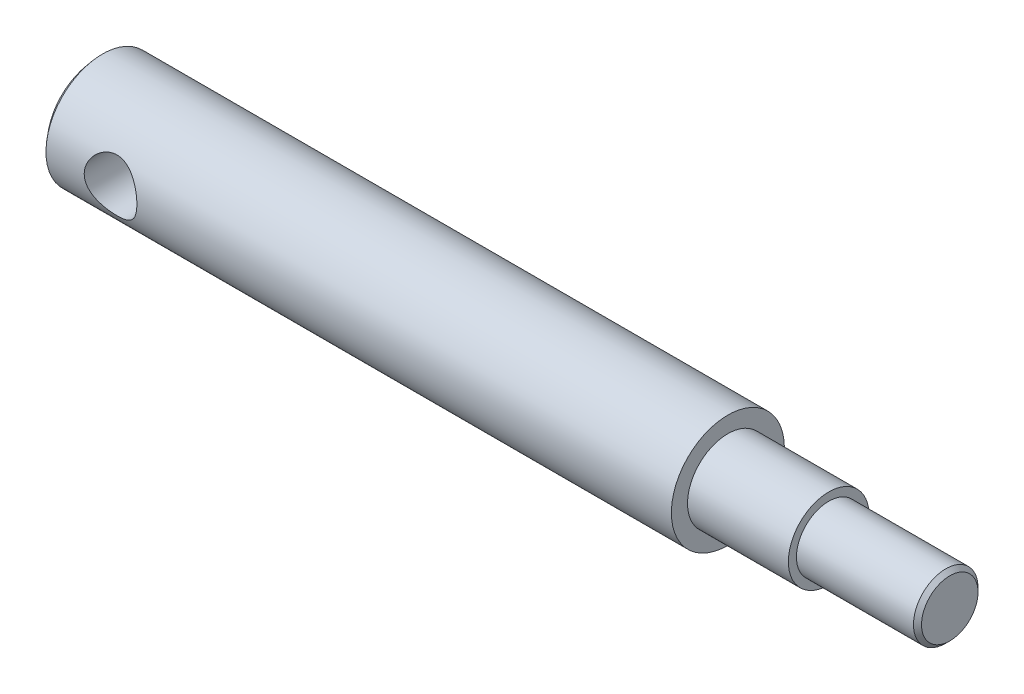
ISO-10303-21;
HEADER;
FILE_DESCRIPTION(('STEP AP214'),'2;1');
FILE_NAME('part.step','',(''),(''),'','','');
FILE_SCHEMA(('AUTOMOTIVE_DESIGN { 1 0 10303 214 1 1 1 1 }'));
ENDSEC;
DATA;
#1=APPLICATION_CONTEXT('core data for automotive mechanical design processes');
#2=APPLICATION_PROTOCOL_DEFINITION('international standard','automotive_design',2000,#1);
#3=PRODUCT_CONTEXT('',#1,'mechanical');
#4=PRODUCT('Part','Part','',(#3));
#5=PRODUCT_RELATED_PRODUCT_CATEGORY('part','',(#4));
#6=PRODUCT_DEFINITION_FORMATION('','',#4);
#7=PRODUCT_DEFINITION_CONTEXT('part definition',#1,'design');
#8=PRODUCT_DEFINITION('design','',#6,#7);
#9=PRODUCT_DEFINITION_SHAPE('','',#8);
#10=(LENGTH_UNIT() NAMED_UNIT(*) SI_UNIT(.MILLI.,.METRE.));
#11=(NAMED_UNIT(*) PLANE_ANGLE_UNIT() SI_UNIT($,.RADIAN.));
#12=(NAMED_UNIT(*) SI_UNIT($,.STERADIAN.) SOLID_ANGLE_UNIT());
#13=UNCERTAINTY_MEASURE_WITH_UNIT(LENGTH_MEASURE(1.E-05),#10,'distance_accuracy_value','');
#14=(GEOMETRIC_REPRESENTATION_CONTEXT(3) GLOBAL_UNCERTAINTY_ASSIGNED_CONTEXT((#13)) GLOBAL_UNIT_ASSIGNED_CONTEXT((#10,
#11,#12)) REPRESENTATION_CONTEXT('',''));
#15=CARTESIAN_POINT('',(0.,0.,0.));
#16=DIRECTION('',(0.,0.,1.));
#17=DIRECTION('',(1.,0.,0.));
#18=AXIS2_PLACEMENT_3D('',#15,#16,#17);
#19=CARTESIAN_POINT('',(21.9709396637103,1.13040271301872,0.));
#20=DIRECTION('',(0.,0.,-1.));
#21=DIRECTION('',(0.,-1.,0.));
#22=AXIS2_PLACEMENT_3D('',#19,#20,#21);
#23=CIRCLE('',#22,22.);
#24=TRIMMED_CURVE('',#23,(PARAMETER_VALUE(-1.51939174944715)),
(PARAMETER_VALUE(1.51939174944715)),.T.,.PARAMETER.);
#25=CARTESIAN_POINT('',(21.9709396637103,0.,0.));
#26=DIRECTION('',(-1.,0.,0.));
#27=AXIS1_PLACEMENT('',#25,#26);
#28=SURFACE_OF_REVOLUTION('',#24,#27);
#29=CARTESIAN_POINT('',(0.,0.,0.));
#30=VERTEX_POINT('',#29);
#31=VERTEX_LOOP('',#30);
#32=FACE_BOUND('',#31,.T.);
#33=CARTESIAN_POINT('',(6.,0.,0.));
#34=DIRECTION('',(-1.,0.,0.));
#35=DIRECTION('',(0.,-1.,0.));
#36=AXIS2_PLACEMENT_3D('',#33,#34,#35);
#37=CIRCLE('',#36,14.);
#38=CARTESIAN_POINT('',(6.,-14.,0.));
#39=VERTEX_POINT('',#38);
#40=EDGE_CURVE('E58',#39,#39,#37,.T.);
#41=ORIENTED_EDGE('',*,*,#40,.T.);
#42=EDGE_LOOP('',(#41));
#43=FACE_BOUND('',#42,.T.);
#44=ADVANCED_FACE('F37',(#32,#43),#28,.T.);
#45=CARTESIAN_POINT('',(216.,0.,0.));
#46=DIRECTION('',(-1.,0.,0.));
#47=DIRECTION('',(0.,-1.,0.));
#48=AXIS2_PLACEMENT_3D('',#45,#46,#47);
#49=PLANE('',#48);
#50=CARTESIAN_POINT('',(216.,0.,0.));
#51=DIRECTION('',(-1.,0.,0.));
#52=DIRECTION('',(0.,-1.,0.));
#53=AXIS2_PLACEMENT_3D('',#50,#51,#52);
#54=CIRCLE('',#53,7.);
#55=CARTESIAN_POINT('',(216.,-7.00000000000003,0.));
#56=VERTEX_POINT('',#55);
#57=EDGE_CURVE('E11',#56,#56,#54,.T.);
#58=ORIENTED_EDGE('',*,*,#57,.F.);
#59=EDGE_LOOP('',(#58));
#60=FACE_BOUND('',#59,.T.);
#61=ADVANCED_FACE('F55',(#60),#49,.F.);
#62=CARTESIAN_POINT('',(216.,0.,0.));
#63=DIRECTION('',(-1.,0.,0.));
#64=DIRECTION('',(0.,-1.,0.));
#65=AXIS2_PLACEMENT_3D('',#62,#63,#64);
#66=CONICAL_SURFACE('',#65,7.,0.785398163397448);
#67=CARTESIAN_POINT('',(215.,0.,0.));
#68=DIRECTION('',(-1.,0.,0.));
#69=DIRECTION('',(0.,-1.,0.));
#70=AXIS2_PLACEMENT_3D('',#67,#68,#69);
#71=CIRCLE('',#70,8.);
#72=CARTESIAN_POINT('',(215.,-8.00000000000004,0.));
#73=VERTEX_POINT('',#72);
#74=EDGE_CURVE('E49',#73,#73,#71,.T.);
#75=ORIENTED_EDGE('',*,*,#74,.F.);
#76=EDGE_LOOP('',(#75));
#77=FACE_BOUND('',#76,.T.);
#78=ORIENTED_EDGE('',*,*,#57,.T.);
#79=EDGE_LOOP('',(#78));
#80=FACE_BOUND('',#79,.T.);
#81=ADVANCED_FACE('F120',(#77,#80),#66,.T.);
#82=CARTESIAN_POINT('',(0.,0.,0.));
#83=DIRECTION('',(-1.,0.,0.));
#84=DIRECTION('',(0.,-1.,0.));
#85=AXIS2_PLACEMENT_3D('',#82,#83,#84);
#86=CYLINDRICAL_SURFACE('',#85,7.99999999999999);
#87=CARTESIAN_POINT('',(186.,0.,0.));
#88=DIRECTION('',(-1.,0.,0.));
#89=DIRECTION('',(0.,-1.,0.));
#90=AXIS2_PLACEMENT_3D('',#87,#88,#89);
#91=CIRCLE('',#90,7.99999999999999);
#92=CARTESIAN_POINT('',(186.,-8.00000000000002,0.));
#93=VERTEX_POINT('',#92);
#94=EDGE_CURVE('E73',#93,#93,#91,.T.);
#95=ORIENTED_EDGE('',*,*,#94,.F.);
#96=EDGE_LOOP('',(#95));
#97=FACE_BOUND('',#96,.T.);
#98=ORIENTED_EDGE('',*,*,#74,.T.);
#99=EDGE_LOOP('',(#98));
#100=FACE_BOUND('',#99,.T.);
#101=ADVANCED_FACE('F114',(#97,#100),#86,.T.);
#102=CARTESIAN_POINT('',(186.,7.99999999999996,0.));
#103=DIRECTION('',(-1.,0.,0.));
#104=DIRECTION('',(0.,-1.,0.));
#105=AXIS2_PLACEMENT_3D('',#102,#103,#104);
#106=PLANE('',#105);
#107=CARTESIAN_POINT('',(186.,0.,0.));
#108=DIRECTION('',(-1.,0.,0.));
#109=DIRECTION('',(0.,-1.,0.));
#110=AXIS2_PLACEMENT_3D('',#107,#108,#109);
#111=CIRCLE('',#110,10.);
#112=CARTESIAN_POINT('',(186.,-10.,0.));
#113=VERTEX_POINT('',#112);
#114=EDGE_CURVE('E70',#113,#113,#111,.T.);
#115=ORIENTED_EDGE('',*,*,#114,.F.);
#116=EDGE_LOOP('',(#115));
#117=FACE_BOUND('',#116,.T.);
#118=ORIENTED_EDGE('',*,*,#94,.T.);
#119=EDGE_LOOP('',(#118));
#120=FACE_BOUND('',#119,.T.);
#121=ADVANCED_FACE('F108',(#117,#120),#106,.F.);
#122=CARTESIAN_POINT('',(0.,0.,0.));
#123=DIRECTION('',(-1.,0.,0.));
#124=DIRECTION('',(0.,-1.,0.));
#125=AXIS2_PLACEMENT_3D('',#122,#123,#124);
#126=CYLINDRICAL_SURFACE('',#125,10.);
#127=CARTESIAN_POINT('',(161.,0.,0.));
#128=DIRECTION('',(-1.,0.,0.));
#129=DIRECTION('',(0.,-1.,0.));
#130=AXIS2_PLACEMENT_3D('',#127,#128,#129);
#131=CIRCLE('',#130,10.);
#132=CARTESIAN_POINT('',(161.,-10.,0.));
#133=VERTEX_POINT('',#132);
#134=EDGE_CURVE('E63',#133,#133,#131,.T.);
#135=ORIENTED_EDGE('',*,*,#134,.F.);
#136=EDGE_LOOP('',(#135));
#137=FACE_BOUND('',#136,.T.);
#138=ORIENTED_EDGE('',*,*,#114,.T.);
#139=EDGE_LOOP('',(#138));
#140=FACE_BOUND('',#139,.T.);
#141=ADVANCED_FACE('F103',(#137,#140),#126,.T.);
#142=CARTESIAN_POINT('',(161.,9.99999999999997,0.));
#143=DIRECTION('',(-1.,0.,0.));
#144=DIRECTION('',(0.,-1.,0.));
#145=AXIS2_PLACEMENT_3D('',#142,#143,#144);
#146=PLANE('',#145);
#147=CARTESIAN_POINT('',(161.,0.,0.));
#148=DIRECTION('',(-1.,0.,0.));
#149=DIRECTION('',(0.,-1.,0.));
#150=AXIS2_PLACEMENT_3D('',#147,#148,#149);
#151=CIRCLE('',#150,14.);
#152=CARTESIAN_POINT('',(161.,-14.,0.));
#153=VERTEX_POINT('',#152);
#154=EDGE_CURVE('E60',#153,#153,#151,.T.);
#155=ORIENTED_EDGE('',*,*,#154,.F.);
#156=EDGE_LOOP('',(#155));
#157=FACE_BOUND('',#156,.T.);
#158=ORIENTED_EDGE('',*,*,#134,.T.);
#159=EDGE_LOOP('',(#158));
#160=FACE_BOUND('',#159,.T.);
#161=ADVANCED_FACE('F92',(#157,#160),#146,.F.);
#162=CARTESIAN_POINT('',(0.,0.,0.));
#163=DIRECTION('',(-1.,0.,0.));
#164=DIRECTION('',(0.,-1.,0.));
#165=AXIS2_PLACEMENT_3D('',#162,#163,#164);
#166=CYLINDRICAL_SURFACE('',#165,14.);
#167=CARTESIAN_POINT('',(28.525,0.,-14.));
#168=CARTESIAN_POINT('',(28.5249988115517,0.172961585399824,-13.9999989763916));
#169=CARTESIAN_POINT('',(28.5181142009919,0.345955335434678,-13.9967866267679));
#170=CARTESIAN_POINT('',(28.4906472082468,0.690686654918813,-13.9840170322902));
#171=CARTESIAN_POINT('',(28.4700576977243,0.86242352360486,-13.9744564855512));
#172=CARTESIAN_POINT('',(28.4153656284769,1.20357884662734,-13.9492186729422));
#173=CARTESIAN_POINT('',(28.3812399649993,1.37299282183549,-13.9335309493484));
#174=CARTESIAN_POINT('',(28.2998340414739,1.70805603372384,-13.8964373934108));
#175=CARTESIAN_POINT('',(28.2525484040739,1.8737037014445,-13.8750292237546));
#176=CARTESIAN_POINT('',(28.1455325345178,2.19938966095088,-13.8271351485203));
#177=CARTESIAN_POINT('',(28.0858547228063,2.35944836591319,-13.8006706682818));
#178=CARTESIAN_POINT('',(27.9544618529155,2.67376897138034,-13.7432347055915));
#179=CARTESIAN_POINT('',(27.8827422987141,2.8280286802885,-13.7122615403098));
#180=CARTESIAN_POINT('',(27.7279092536524,3.12976206362347,-13.6465529347583));
#181=CARTESIAN_POINT('',(27.6448027589596,3.27723983115224,-13.6118198073492));
#182=CARTESIAN_POINT('',(27.4677595136981,3.5647963977443,-13.5393595459155));
#183=CARTESIAN_POINT('',(27.3738188114603,3.70487246977678,-13.5016313210325));
#184=CARTESIAN_POINT('',(27.0658905241392,4.12772725323102,-13.3809785077786));
#185=CARTESIAN_POINT('',(26.8341505463098,4.39678369077359,-13.2942642643216));
#186=CARTESIAN_POINT('',(26.3303201868583,4.89380166725161,-13.1194636813799));
#187=CARTESIAN_POINT('',(26.0582035223154,5.12173622241704,-13.0313764818575));
#188=CARTESIAN_POINT('',(25.6146104957753,5.43561918418218,-12.9022479894684));
#189=CARTESIAN_POINT('',(25.4554620225076,5.53817375744851,-12.8584428072728));
#190=CARTESIAN_POINT('',(25.1281745789026,5.72940047695437,-12.7743832344047));
#191=CARTESIAN_POINT('',(24.9600393698687,5.81807837103057,-12.7341273766049));
#192=CARTESIAN_POINT('',(24.6157626284436,5.98077462726117,-12.6585303796142));
#193=CARTESIAN_POINT('',(24.4396213238958,6.05479340627466,-12.6231891006767));
#194=CARTESIAN_POINT('',(24.0805936424508,6.18735332878388,-12.558745759908));
#195=CARTESIAN_POINT('',(23.8977110859509,6.24590308975199,-12.5296402259874));
#196=CARTESIAN_POINT('',(23.5368302827655,6.3440349244786,-12.4802272326424));
#197=CARTESIAN_POINT('',(23.3591238661684,6.38448902139485,-12.4595212822462));
#198=CARTESIAN_POINT('',(23.0002550028711,6.45045668760313,-12.4254976779733));
#199=CARTESIAN_POINT('',(22.8190926864606,6.4759708189967,-12.4121797461307));
#200=CARTESIAN_POINT('',(22.4549764606993,6.51168669968097,-12.3934799341597));
#201=CARTESIAN_POINT('',(22.2720238246464,6.52189863375825,-12.388092775535));
#202=CARTESIAN_POINT('',(21.9058560399226,6.52688900167993,-12.3854645237547));
#203=CARTESIAN_POINT('',(21.7226409119551,6.52166859223294,-12.3882228200683));
#204=CARTESIAN_POINT('',(21.3760237847957,6.49718053639865,-12.4010807663484));
#205=CARTESIAN_POINT('',(21.2124867145946,6.47938234327562,-12.4104121469332));
#206=CARTESIAN_POINT('',(20.8876268593489,6.43157933933405,-12.4352528359294));
#207=CARTESIAN_POINT('',(20.7263048358651,6.40157043383264,-12.4507642166765));
#208=CARTESIAN_POINT('',(20.4070281826959,6.32967932482515,-12.4874650625722));
#209=CARTESIAN_POINT('',(20.249072938609,6.28779930796615,-12.5086534819766));
#210=CARTESIAN_POINT('',(19.9373822864394,6.19256031253001,-12.5560751969003));
#211=CARTESIAN_POINT('',(19.7836485493526,6.13919686027294,-12.5823104581283));
#212=CARTESIAN_POINT('',(19.4778565907212,6.02012794604626,-12.6397200367822));
#213=CARTESIAN_POINT('',(19.3259148480781,5.9541707055845,-12.6709926166382));
#214=CARTESIAN_POINT('',(19.0280908928989,5.81125528934605,-12.7371704644988));
#215=CARTESIAN_POINT('',(18.8822108893314,5.73429314784985,-12.7720770408097));
#216=CARTESIAN_POINT('',(18.4547119198259,5.48768922342668,-12.8808992105527));
#217=CARTESIAN_POINT('',(18.183079041386,5.30226913436631,-12.9589478321659));
#218=CARTESIAN_POINT('',(17.6435687383132,4.87122899435165,-13.1274558652518));
#219=CARTESIAN_POINT('',(17.3792818546795,4.62126474054235,-13.2183440942223));
#220=CARTESIAN_POINT('',(17.0162561033881,4.21556240904635,-13.3510078610789));
#221=CARTESIAN_POINT('',(16.9007457212029,4.07509303387123,-13.3946469871098));
#222=CARTESIAN_POINT('',(16.6815667853414,3.78456900183374,-13.4796104485132));
#223=CARTESIAN_POINT('',(16.5778937527845,3.63451800408817,-13.5209356563632));
#224=CARTESIAN_POINT('',(16.3796197240387,3.32005136498873,-13.6016379344314));
#225=CARTESIAN_POINT('',(16.2854797901025,3.15531303915948,-13.6408912818627));
#226=CARTESIAN_POINT('',(16.1115764943754,2.8174750155879,-13.7146529983504));
#227=CARTESIAN_POINT('',(16.031807154623,2.64437883276825,-13.7491633390066));
#228=CARTESIAN_POINT('',(15.8874476453614,2.29101329254452,-13.8124386579041));
#229=CARTESIAN_POINT('',(15.8228524449784,2.11074633580134,-13.8412055398706));
#230=CARTESIAN_POINT('',(15.7095682957501,1.74437589518114,-13.8921323873824));
#231=CARTESIAN_POINT('',(15.660877787126,1.55827298560124,-13.9142930007883));
#232=CARTESIAN_POINT('',(15.5830642534276,1.19594077902035,-13.9499225229576));
#233=CARTESIAN_POINT('',(15.5527465542942,1.02001925822351,-13.9639190924338));
#234=CARTESIAN_POINT('',(15.5066117107657,0.665890433565692,-13.9852796172365));
#235=CARTESIAN_POINT('',(15.490793503867,0.487683298162089,-13.992644058556));
#236=CARTESIAN_POINT('',(15.4738554552897,0.13047788204371,-14.0005314804953));
#237=CARTESIAN_POINT('',(15.4727309478196,-0.0485201294777111,-14.0010566328414));
#238=CARTESIAN_POINT('',(15.4851828551948,-0.405888971009854,-13.9952558452273));
#239=CARTESIAN_POINT('',(15.4987587737087,-0.584259821991451,-13.988930136573));
#240=CARTESIAN_POINT('',(15.539070984327,-0.92728862158225,-13.9702428704934));
#241=CARTESIAN_POINT('',(15.5648862570086,-1.09207901115573,-13.9583041542548));
#242=CARTESIAN_POINT('',(15.6289395296203,-1.41877781854867,-13.928890003336));
#243=CARTESIAN_POINT('',(15.667181512164,-1.58068529485823,-13.9114127936784));
#244=CARTESIAN_POINT('',(15.7556943002216,-1.90047071621246,-13.8713436001078));
#245=CARTESIAN_POINT('',(15.8059615391909,-2.05834984068173,-13.8487531328315));
#246=CARTESIAN_POINT('',(15.9180905730616,-2.36924583478781,-13.7989664212972));
#247=CARTESIAN_POINT('',(15.9799567995973,-2.52226081975797,-13.7717684170183));
#248=CARTESIAN_POINT('',(16.1168084470812,-2.82708742867824,-13.7124906076469));
#249=CARTESIAN_POINT('',(16.1921341771189,-2.97872256024072,-13.6802879935455));
#250=CARTESIAN_POINT('',(16.3539563562946,-3.27511289944075,-13.6123766267351));
#251=CARTESIAN_POINT('',(16.4404569004608,-3.41986555825091,-13.5766665898813));
#252=CARTESIAN_POINT('',(16.7158502844001,-3.84270665563548,-13.4654497118022));
#253=CARTESIAN_POINT('',(16.9207084430537,-4.10954097919031,-13.3858231514148));
#254=CARTESIAN_POINT('',(17.3876381841635,-4.62975268144804,-13.2154043406347));
#255=CARTESIAN_POINT('',(17.6531501049967,-4.87990226815509,-13.1242450729771));
#256=CARTESIAN_POINT('',(18.2234280171084,-5.33344766120907,-12.9465716243688));
#257=CARTESIAN_POINT('',(18.5282125059958,-5.53682130929723,-12.8600596597061));
#258=CARTESIAN_POINT('',(19.0148182921882,-5.80519094930558,-12.7400866812116));
#259=CARTESIAN_POINT('',(19.1848810653573,-5.8895626271787,-12.7011926943675));
#260=CARTESIAN_POINT('',(19.5326369236379,-6.04349581775784,-12.6286733960662));
#261=CARTESIAN_POINT('',(19.7103265477264,-6.11306396459723,-12.5950457263251));
#262=CARTESIAN_POINT('',(20.072003611947,-6.23658222951957,-12.5343442158876));
#263=CARTESIAN_POINT('',(20.2559866884431,-6.29054293321921,-12.5072659351743));
#264=CARTESIAN_POINT('',(20.6289039252938,-6.38220710441621,-12.4607417244458));
#265=CARTESIAN_POINT('',(20.8178374439198,-6.41991266812526,-12.4412948103427));
#266=CARTESIAN_POINT('',(21.1817975844801,-6.47587500323594,-12.4122496079689));
#267=CARTESIAN_POINT('',(21.3565449320331,-6.49557708687484,-12.4019222949216));
#268=CARTESIAN_POINT('',(21.7073353609104,-6.52080412662806,-12.3886771358058));
#269=CARTESIAN_POINT('',(21.8833783401378,-6.52633018807912,-12.3857587120496));
#270=CARTESIAN_POINT('',(22.2352546483854,-6.52313057528069,-12.3874440236919));
#271=CARTESIAN_POINT('',(22.4110880167595,-6.51440822838443,-12.3920460028918));
#272=CARTESIAN_POINT('',(22.7611277111579,-6.48283802946988,-12.4085908784934));
#273=CARTESIAN_POINT('',(22.9353340755161,-6.45999051111193,-12.4205336014944));
#274=CARTESIAN_POINT('',(23.2681439100937,-6.40264322892484,-12.4501853406126));
#275=CARTESIAN_POINT('',(23.4269593462454,-6.36911384671562,-12.467410770028));
#276=CARTESIAN_POINT('',(23.7410633757841,-6.29051221557066,-12.5072537515944));
#277=CARTESIAN_POINT('',(23.8963508388004,-6.24543632234307,-12.52987300598));
#278=CARTESIAN_POINT('',(24.202452012443,-6.14416880409381,-12.5798399519487));
#279=CARTESIAN_POINT('',(24.3532662948025,-6.0879786067329,-12.6071870361731));
#280=CARTESIAN_POINT('',(24.6497026242441,-5.96493813634604,-12.6658657668393));
#281=CARTESIAN_POINT('',(24.7953227402962,-5.89808394829492,-12.6971988757946));
#282=CARTESIAN_POINT('',(25.2421227488125,-5.6727544254494,-12.8003252418963));
#283=CARTESIAN_POINT('',(25.5330682312975,-5.49613888531191,-12.8778161655023));
#284=CARTESIAN_POINT('',(26.0829370858879,-5.10098162511737,-13.0393796079082));
#285=CARTESIAN_POINT('',(26.3418454529104,-4.88242038046838,-13.1234551808546));
#286=CARTESIAN_POINT('',(26.7146680208038,-4.51465719729695,-13.2528145150157));
#287=CARTESIAN_POINT('',(26.8414509308316,-4.37842943239779,-13.298550359562));
#288=CARTESIAN_POINT('',(27.0831370874232,-4.09535677477689,-13.388430498827));
#289=CARTESIAN_POINT('',(27.1980443531618,-3.94851550285481,-13.4325753286903));
#290=CARTESIAN_POINT('',(27.4153066692637,-3.64485529779217,-13.518133751299));
#291=CARTESIAN_POINT('',(27.5176497591398,-3.48802706991157,-13.5595447244783));
#292=CARTESIAN_POINT('',(27.7088063697523,-3.1654819891947,-13.6384481649685));
#293=CARTESIAN_POINT('',(27.7976261393903,-2.99976928988265,-13.675942439591));
#294=CARTESIAN_POINT('',(27.9605671899454,-2.6612721793951,-13.745811885276));
#295=CARTESIAN_POINT('',(28.0347592102392,-2.48852693331197,-13.7782115315379));
#296=CARTESIAN_POINT('',(28.1681860308318,-2.13647333246544,-13.837171365666));
#297=CARTESIAN_POINT('',(28.2274281017542,-1.95716821673892,-13.863734391246));
#298=CARTESIAN_POINT('',(28.3301864336825,-1.59372144054663,-13.910195521747));
#299=CARTESIAN_POINT('',(28.3737391340218,-1.40959206665998,-13.9301090624528));
#300=CARTESIAN_POINT('',(28.4447310404681,-1.03771715503998,-13.9627337045398));
#301=CARTESIAN_POINT('',(28.4721809319526,-0.849974100876467,-13.9754495818939));
#302=CARTESIAN_POINT('',(28.5025884878905,-0.551502206533346,-13.9895655974164));
#303=CARTESIAN_POINT('',(28.510988318285,-0.441414367152065,-13.9934741984445));
#304=CARTESIAN_POINT('',(28.5221945089965,-0.22088872858987,-13.9986917522194));
#305=CARTESIAN_POINT('',(28.525000758927,-0.11045092254561,-14.0000006536624));
#306=CARTESIAN_POINT('',(28.525,0.,-14.));
#307=B_SPLINE_CURVE_WITH_KNOTS('',3,(#167,#168,#169,#170,#171,#172,#173,#174,#175,#176,#177,
#178,#179,#180,#181,#182,#183,#184,#185,#186,#187,#188,#189,#190,#191,#192,#193,#194,#195,#196,
#197,#198,#199,#200,#201,#202,#203,#204,#205,#206,#207,#208,#209,#210,#211,#212,#213,#214,#215,
#216,#217,#218,#219,#220,#221,#222,#223,#224,#225,#226,#227,#228,#229,#230,#231,#232,#233,#234,
#235,#236,#237,#238,#239,#240,#241,#242,#243,#244,#245,#246,#247,#248,#249,#250,#251,#252,#253,
#254,#255,#256,#257,#258,#259,#260,#261,#262,#263,#264,#265,#266,#267,#268,#269,#270,#271,#272,
#273,#274,#275,#276,#277,#278,#279,#280,#281,#282,#283,#284,#285,#286,#287,#288,#289,#290,#291,
#292,#293,#294,#295,#296,#297,#298,#299,#300,#301,#302,#303,#304,#305,#306),.UNSPECIFIED.,.T.,
.F.,(4,2,2,2,2,2,2,2,2,2,2,2,2,2,2,2,2,2,2,2,2,2,2,2,2,2,2,2,2,2,2,2,2,2,2,2,2,2,2,2,2,2,2,2,2,
2,2,2,2,2,2,2,2,2,2,2,2,2,2,2,2,2,2,2,2,2,2,2,2,4),(0.,0.518774771874318,1.03781958542481,
1.5577541914376,2.07790156282594,2.59589190290913,3.11407607673987,3.63194329262075,
4.14999999635844,5.24166307129228,6.33403989966914,6.91641013486512,7.49853850525524,
8.08065031936875,8.66243716389735,9.21195049476588,9.76144314940579,10.3105699118167,
10.8596555162821,11.3533769616188,11.847264105805,12.3410603355145,12.8350492861673,
13.3402076103385,13.8455484339837,14.8557277305862,15.9752751148162,16.53583521864,
17.0961825163367,17.676705999723,18.2569874332041,18.8370762062759,19.4171080727391,
19.9535903845765,20.4900333805529,21.0263060319568,21.5625605777169,22.0636627803876,
22.5649257390507,23.0660402131396,23.5673465400505,24.0838208546064,24.6004849717052,
25.6332742036848,26.7565587750209,27.8803743672462,28.4610799247573,29.0415246911394,
29.6215748476069,30.20155018024,30.7293123413865,31.2570333504645,31.7846311413446,
32.3122164699522,32.8013580175243,33.2906541378189,33.7798874475458,34.2693007825445,
35.3119615810932,36.3551088923693,36.9294367609827,37.5035696140133,38.0782448440269,
38.6526537149474,39.2242126872133,39.7954931546092,40.3654381079992,40.9350044326507,
41.2662804282833,41.5975629614219),.UNSPECIFIED.);
#308=CARTESIAN_POINT('',(28.525,0.,-14.));
#309=VERTEX_POINT('',#308);
#310=EDGE_CURVE('E40',#309,#309,#307,.T.);
#311=ORIENTED_EDGE('',*,*,#310,.T.);
#312=EDGE_LOOP('',(#311));
#313=FACE_BOUND('',#312,.T.);
#314=CARTESIAN_POINT('',(28.525,0.,14.));
#315=CARTESIAN_POINT('',(28.5249988115517,-0.172961585399824,13.9999989763916));
#316=CARTESIAN_POINT('',(28.5181142009919,-0.345955335434678,13.9967866267679));
#317=CARTESIAN_POINT('',(28.4906472082468,-0.690686654918813,13.9840170322902));
#318=CARTESIAN_POINT('',(28.4700576977243,-0.862423523604859,13.9744564855512));
#319=CARTESIAN_POINT('',(28.4153656284769,-1.20357884662734,13.9492186729422));
#320=CARTESIAN_POINT('',(28.3812399649993,-1.37299282183549,13.9335309493484));
#321=CARTESIAN_POINT('',(28.2998340414739,-1.70805603372384,13.8964373934108));
#322=CARTESIAN_POINT('',(28.2525484040739,-1.8737037014445,13.8750292237546));
#323=CARTESIAN_POINT('',(28.1455325345178,-2.19938966095088,13.8271351485203));
#324=CARTESIAN_POINT('',(28.0858547228063,-2.35944836591319,13.8006706682818));
#325=CARTESIAN_POINT('',(27.9544618529155,-2.67376897138034,13.7432347055915));
#326=CARTESIAN_POINT('',(27.8827422987141,-2.8280286802885,13.7122615403098));
#327=CARTESIAN_POINT('',(27.7279092536524,-3.12976206362347,13.6465529347583));
#328=CARTESIAN_POINT('',(27.6448027589596,-3.27723983115224,13.6118198073492));
#329=CARTESIAN_POINT('',(27.4677595136981,-3.5647963977443,13.5393595459155));
#330=CARTESIAN_POINT('',(27.3738188114603,-3.70487246977678,13.5016313210325));
#331=CARTESIAN_POINT('',(27.0658905241392,-4.12772725323102,13.3809785077786));
#332=CARTESIAN_POINT('',(26.8341505463098,-4.39678369077359,13.2942642643216));
#333=CARTESIAN_POINT('',(26.3303201868583,-4.89380166725161,13.11946368138));
#334=CARTESIAN_POINT('',(26.0582035223154,-5.12173622241704,13.0313764818575));
#335=CARTESIAN_POINT('',(25.6146104957753,-5.43561918418218,12.9022479894684));
#336=CARTESIAN_POINT('',(25.4554620225076,-5.53817375744852,12.8584428072728));
#337=CARTESIAN_POINT('',(25.1281745789026,-5.72940047695437,12.7743832344047));
#338=CARTESIAN_POINT('',(24.9600393698687,-5.81807837103057,12.7341273766049));
#339=CARTESIAN_POINT('',(24.6157626284436,-5.98077462726117,12.6585303796142));
#340=CARTESIAN_POINT('',(24.4396213238958,-6.05479340627466,12.6231891006767));
#341=CARTESIAN_POINT('',(24.0805936424508,-6.18735332878388,12.558745759908));
#342=CARTESIAN_POINT('',(23.8977110859509,-6.24590308975199,12.5296402259874));
#343=CARTESIAN_POINT('',(23.5368302827655,-6.3440349244786,12.4802272326424));
#344=CARTESIAN_POINT('',(23.3591238661684,-6.38448902139485,12.4595212822462));
#345=CARTESIAN_POINT('',(23.0002550028712,-6.45045668760313,12.4254976779733));
#346=CARTESIAN_POINT('',(22.8190926864607,-6.4759708189967,12.4121797461307));
#347=CARTESIAN_POINT('',(22.4549764606993,-6.51168669968097,12.3934799341597));
#348=CARTESIAN_POINT('',(22.2720238246464,-6.52189863375825,12.388092775535));
#349=CARTESIAN_POINT('',(21.9058560399226,-6.52688900167993,12.3854645237547));
#350=CARTESIAN_POINT('',(21.7226409119551,-6.52166859223294,12.3882228200683));
#351=CARTESIAN_POINT('',(21.3760237847957,-6.49718053639864,12.4010807663484));
#352=CARTESIAN_POINT('',(21.2124867145946,-6.47938234327562,12.4104121469332));
#353=CARTESIAN_POINT('',(20.8876268593489,-6.43157933933405,12.4352528359294));
#354=CARTESIAN_POINT('',(20.7263048358651,-6.40157043383264,12.4507642166765));
#355=CARTESIAN_POINT('',(20.4070281826959,-6.32967932482515,12.4874650625723));
#356=CARTESIAN_POINT('',(20.249072938609,-6.28779930796615,12.5086534819766));
#357=CARTESIAN_POINT('',(19.9373822864394,-6.19256031253001,12.5560751969003));
#358=CARTESIAN_POINT('',(19.7836485493526,-6.13919686027294,12.5823104581283));
#359=CARTESIAN_POINT('',(19.4778565907212,-6.02012794604626,12.6397200367822));
#360=CARTESIAN_POINT('',(19.3259148480781,-5.9541707055845,12.6709926166382));
#361=CARTESIAN_POINT('',(19.0280908928989,-5.81125528934605,12.7371704644988));
#362=CARTESIAN_POINT('',(18.8822108893314,-5.73429314784985,12.7720770408097));
#363=CARTESIAN_POINT('',(18.4547119198259,-5.48768922342667,12.8808992105527));
#364=CARTESIAN_POINT('',(18.183079041386,-5.30226913436631,12.9589478321659));
#365=CARTESIAN_POINT('',(17.6435687383132,-4.87122899435165,13.1274558652518));
#366=CARTESIAN_POINT('',(17.3792818546795,-4.62126474054235,13.2183440942223));
#367=CARTESIAN_POINT('',(17.0162561033881,-4.21556240904634,13.3510078610789));
#368=CARTESIAN_POINT('',(16.9007457212029,-4.07509303387123,13.3946469871098));
#369=CARTESIAN_POINT('',(16.6815667853414,-3.78456900183374,13.4796104485132));
#370=CARTESIAN_POINT('',(16.5778937527845,-3.63451800408816,13.5209356563632));
#371=CARTESIAN_POINT('',(16.3796197240387,-3.32005136498873,13.6016379344314));
#372=CARTESIAN_POINT('',(16.2854797901025,-3.15531303915948,13.6408912818627));
#373=CARTESIAN_POINT('',(16.1115764943754,-2.8174750155879,13.7146529983504));
#374=CARTESIAN_POINT('',(16.031807154623,-2.64437883276825,13.7491633390066));
#375=CARTESIAN_POINT('',(15.8874476453614,-2.29101329254452,13.8124386579041));
#376=CARTESIAN_POINT('',(15.8228524449784,-2.11074633580134,13.8412055398706));
#377=CARTESIAN_POINT('',(15.7095682957501,-1.74437589518114,13.8921323873824));
#378=CARTESIAN_POINT('',(15.660877787126,-1.55827298560124,13.9142930007883));
#379=CARTESIAN_POINT('',(15.5830642534276,-1.19594077902035,13.9499225229576));
#380=CARTESIAN_POINT('',(15.5527465542942,-1.02001925822351,13.9639190924338));
#381=CARTESIAN_POINT('',(15.5066117107657,-0.665890433565692,13.9852796172365));
#382=CARTESIAN_POINT('',(15.490793503867,-0.48768329816209,13.992644058556));
#383=CARTESIAN_POINT('',(15.4738554552897,-0.130477882043712,14.0005314804953));
#384=CARTESIAN_POINT('',(15.4727309478196,0.048520129477709,14.0010566328414));
#385=CARTESIAN_POINT('',(15.4851828551948,0.405888971009852,13.9952558452273));
#386=CARTESIAN_POINT('',(15.4987587737087,0.584259821991449,13.988930136573));
#387=CARTESIAN_POINT('',(15.539070984327,0.927288621582249,13.9702428704934));
#388=CARTESIAN_POINT('',(15.5648862570086,1.09207901115573,13.9583041542548));
#389=CARTESIAN_POINT('',(15.6289395296203,1.41877781854867,13.928890003336));
#390=CARTESIAN_POINT('',(15.667181512164,1.58068529485822,13.9114127936784));
#391=CARTESIAN_POINT('',(15.7556943002216,1.90047071621246,13.8713436001078));
#392=CARTESIAN_POINT('',(15.8059615391909,2.05834984068173,13.8487531328315));
#393=CARTESIAN_POINT('',(15.9180905730616,2.3692458347878,13.7989664212972));
#394=CARTESIAN_POINT('',(15.9799567995973,2.52226081975797,13.7717684170182));
#395=CARTESIAN_POINT('',(16.1168084470812,2.82708742867824,13.7124906076469));
#396=CARTESIAN_POINT('',(16.1921341771189,2.97872256024072,13.6802879935455));
#397=CARTESIAN_POINT('',(16.3539563562946,3.27511289944075,13.6123766267351));
#398=CARTESIAN_POINT('',(16.4404569004608,3.41986555825092,13.5766665898813));
#399=CARTESIAN_POINT('',(16.7158502844001,3.84270665563548,13.4654497118022));
#400=CARTESIAN_POINT('',(16.9207084430537,4.10954097919032,13.3858231514148));
#401=CARTESIAN_POINT('',(17.3876381841635,4.62975268144804,13.2154043406347));
#402=CARTESIAN_POINT('',(17.6531501049967,4.87990226815509,13.1242450729771));
#403=CARTESIAN_POINT('',(18.2234280171084,5.33344766120907,12.9465716243688));
#404=CARTESIAN_POINT('',(18.5282125059958,5.53682130929723,12.8600596597061));
#405=CARTESIAN_POINT('',(19.0148182921882,5.80519094930559,12.7400866812116));
#406=CARTESIAN_POINT('',(19.1848810653573,5.8895626271787,12.7011926943675));
#407=CARTESIAN_POINT('',(19.5326369236379,6.04349581775784,12.6286733960662));
#408=CARTESIAN_POINT('',(19.7103265477264,6.11306396459724,12.5950457263251));
#409=CARTESIAN_POINT('',(20.072003611947,6.23658222951957,12.5343442158876));
#410=CARTESIAN_POINT('',(20.2559866884431,6.29054293321921,12.5072659351743));
#411=CARTESIAN_POINT('',(20.6289039252938,6.38220710441621,12.4607417244458));
#412=CARTESIAN_POINT('',(20.8178374439198,6.41991266812526,12.4412948103427));
#413=CARTESIAN_POINT('',(21.1817975844801,6.47587500323594,12.4122496079689));
#414=CARTESIAN_POINT('',(21.3565449320331,6.49557708687483,12.4019222949216));
#415=CARTESIAN_POINT('',(21.7073353609104,6.52080412662805,12.3886771358058));
#416=CARTESIAN_POINT('',(21.8833783401378,6.52633018807912,12.3857587120496));
#417=CARTESIAN_POINT('',(22.2352546483854,6.52313057528069,12.3874440236919));
#418=CARTESIAN_POINT('',(22.4110880167595,6.51440822838443,12.3920460028918));
#419=CARTESIAN_POINT('',(22.7611277111579,6.48283802946988,12.4085908784934));
#420=CARTESIAN_POINT('',(22.9353340755161,6.45999051111193,12.4205336014944));
#421=CARTESIAN_POINT('',(23.2681439100937,6.40264322892484,12.4501853406126));
#422=CARTESIAN_POINT('',(23.4269593462454,6.36911384671562,12.467410770028));
#423=CARTESIAN_POINT('',(23.7410633757841,6.29051221557066,12.5072537515944));
#424=CARTESIAN_POINT('',(23.8963508388004,6.24543632234307,12.52987300598));
#425=CARTESIAN_POINT('',(24.202452012443,6.14416880409381,12.5798399519487));
#426=CARTESIAN_POINT('',(24.3532662948025,6.0879786067329,12.6071870361731));
#427=CARTESIAN_POINT('',(24.6497026242441,5.96493813634604,12.6658657668393));
#428=CARTESIAN_POINT('',(24.7953227402962,5.89808394829493,12.6971988757946));
#429=CARTESIAN_POINT('',(25.2421227488125,5.6727544254494,12.8003252418963));
#430=CARTESIAN_POINT('',(25.5330682312975,5.49613888531191,12.8778161655023));
#431=CARTESIAN_POINT('',(26.0829370858879,5.10098162511737,13.0393796079082));
#432=CARTESIAN_POINT('',(26.3418454529104,4.88242038046839,13.1234551808546));
#433=CARTESIAN_POINT('',(26.7146680208038,4.51465719729695,13.2528145150157));
#434=CARTESIAN_POINT('',(26.8414509308316,4.3784294323978,13.298550359562));
#435=CARTESIAN_POINT('',(27.0831370874231,4.09535677477689,13.388430498827));
#436=CARTESIAN_POINT('',(27.1980443531618,3.94851550285481,13.4325753286903));
#437=CARTESIAN_POINT('',(27.4153066692637,3.64485529779217,13.518133751299));
#438=CARTESIAN_POINT('',(27.5176497591398,3.48802706991157,13.5595447244783));
#439=CARTESIAN_POINT('',(27.7088063697523,3.16548198919471,13.6384481649685));
#440=CARTESIAN_POINT('',(27.7976261393903,2.99976928988265,13.675942439591));
#441=CARTESIAN_POINT('',(27.9605671899454,2.6612721793951,13.745811885276));
#442=CARTESIAN_POINT('',(28.0347592102392,2.48852693331198,13.7782115315379));
#443=CARTESIAN_POINT('',(28.1681860308318,2.13647333246544,13.837171365666));
#444=CARTESIAN_POINT('',(28.2274281017542,1.95716821673892,13.863734391246));
#445=CARTESIAN_POINT('',(28.3301864336825,1.59372144054663,13.910195521747));
#446=CARTESIAN_POINT('',(28.3737391340218,1.40959206665998,13.9301090624528));
#447=CARTESIAN_POINT('',(28.4447310404681,1.03771715503998,13.9627337045398));
#448=CARTESIAN_POINT('',(28.4721809319526,0.849974100876468,13.9754495818939));
#449=CARTESIAN_POINT('',(28.5025884878905,0.551502206533348,13.9895655974164));
#450=CARTESIAN_POINT('',(28.510988318285,0.441414367152067,13.9934741984445));
#451=CARTESIAN_POINT('',(28.5221945089965,0.220888728589871,13.9986917522194));
#452=CARTESIAN_POINT('',(28.525000758927,0.11045092254561,14.0000006536624));
#453=CARTESIAN_POINT('',(28.525,0.,14.));
#454=B_SPLINE_CURVE_WITH_KNOTS('',3,(#314,#315,#316,#317,#318,#319,#320,#321,#322,#323,#324,
#325,#326,#327,#328,#329,#330,#331,#332,#333,#334,#335,#336,#337,#338,#339,#340,#341,#342,#343,
#344,#345,#346,#347,#348,#349,#350,#351,#352,#353,#354,#355,#356,#357,#358,#359,#360,#361,#362,
#363,#364,#365,#366,#367,#368,#369,#370,#371,#372,#373,#374,#375,#376,#377,#378,#379,#380,#381,
#382,#383,#384,#385,#386,#387,#388,#389,#390,#391,#392,#393,#394,#395,#396,#397,#398,#399,#400,
#401,#402,#403,#404,#405,#406,#407,#408,#409,#410,#411,#412,#413,#414,#415,#416,#417,#418,#419,
#420,#421,#422,#423,#424,#425,#426,#427,#428,#429,#430,#431,#432,#433,#434,#435,#436,#437,#438,
#439,#440,#441,#442,#443,#444,#445,#446,#447,#448,#449,#450,#451,#452,#453),.UNSPECIFIED.,.T.,
.F.,(4,2,2,2,2,2,2,2,2,2,2,2,2,2,2,2,2,2,2,2,2,2,2,2,2,2,2,2,2,2,2,2,2,2,2,2,2,2,2,2,2,2,2,2,2,
2,2,2,2,2,2,2,2,2,2,2,2,2,2,2,2,2,2,2,2,2,2,2,2,4),(0.,0.518774771874318,1.03781958542481,
1.5577541914376,2.07790156282594,2.59589190290913,3.11407607673987,3.63194329262075,
4.14999999635844,5.24166307129228,6.33403989966914,6.91641013486512,7.49853850525523,
8.08065031936875,8.66243716389734,9.21195049476587,9.76144314940578,10.3105699118167,
10.8596555162821,11.3533769616188,11.847264105805,12.3410603355145,12.8350492861673,
13.3402076103385,13.8455484339837,14.8557277305862,15.9752751148162,16.53583521864,
17.0961825163367,17.676705999723,18.2569874332041,18.8370762062759,19.4171080727391,
19.9535903845765,20.4900333805529,21.0263060319568,21.5625605777169,22.0636627803876,
22.5649257390507,23.0660402131396,23.5673465400505,24.0838208546064,24.6004849717052,
25.6332742036848,26.7565587750209,27.8803743672462,28.4610799247574,29.0415246911394,
29.6215748476069,30.20155018024,30.7293123413865,31.2570333504645,31.7846311413446,
32.3122164699522,32.8013580175243,33.2906541378189,33.7798874475458,34.2693007825445,
35.3119615810932,36.3551088923693,36.9294367609827,37.5035696140133,38.0782448440269,
38.6526537149474,39.2242126872133,39.7954931546092,40.3654381079992,40.9350044326507,
41.2662804282834,41.5975629614219),.UNSPECIFIED.);
#455=CARTESIAN_POINT('',(28.525,0.,14.));
#456=VERTEX_POINT('',#455);
#457=EDGE_CURVE('E66',#456,#456,#454,.T.);
#458=ORIENTED_EDGE('',*,*,#457,.T.);
#459=EDGE_LOOP('',(#458));
#460=FACE_BOUND('',#459,.T.);
#461=ORIENTED_EDGE('',*,*,#40,.F.);
#462=EDGE_LOOP('',(#461));
#463=FACE_BOUND('',#462,.T.);
#464=ORIENTED_EDGE('',*,*,#154,.T.);
#465=EDGE_LOOP('',(#464));
#466=FACE_BOUND('',#465,.T.);
#467=ADVANCED_FACE('F81',(#313,#460,#463,#466),#166,.T.);
#468=CARTESIAN_POINT('',(22.,0.,-54.5));
#469=DIRECTION('',(0.,0.,1.));
#470=DIRECTION('',(1.,0.,0.));
#471=AXIS2_PLACEMENT_3D('',#468,#469,#470);
#472=CYLINDRICAL_SURFACE('',#471,6.525);
#473=ORIENTED_EDGE('',*,*,#457,.F.);
#474=EDGE_LOOP('',(#473));
#475=FACE_BOUND('',#474,.T.);
#476=ORIENTED_EDGE('',*,*,#310,.F.);
#477=EDGE_LOOP('',(#476));
#478=FACE_BOUND('',#477,.T.);
#479=ADVANCED_FACE('F84',(#475,#478),#472,.F.);
#480=CLOSED_SHELL('',(#44,#61,#81,#101,#121,#141,#161,#467,#479));
#481=MANIFOLD_SOLID_BREP('B2',#480);
#482=ADVANCED_BREP_SHAPE_REPRESENTATION('',(#18,#481),#14);
#483=SHAPE_DEFINITION_REPRESENTATION(#9,#482);
ENDSEC;
END-ISO-10303-21;
